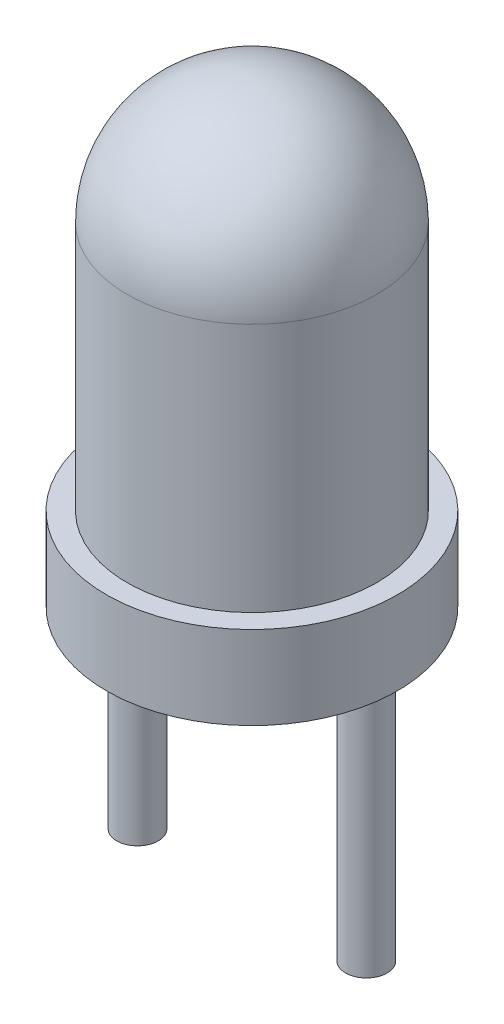
ISO-10303-21;
HEADER;
FILE_DESCRIPTION(('STEP AP214'),'2;1');
FILE_NAME('part.step','',(''),(''),'','','');
FILE_SCHEMA(('AUTOMOTIVE_DESIGN { 1 0 10303 214 1 1 1 1 }'));
ENDSEC;
DATA;
#1=APPLICATION_CONTEXT('core data for automotive mechanical design processes');
#2=APPLICATION_PROTOCOL_DEFINITION('international standard','automotive_design',2000,#1);
#3=PRODUCT_CONTEXT('',#1,'mechanical');
#4=PRODUCT('Part','Part','',(#3));
#5=PRODUCT_RELATED_PRODUCT_CATEGORY('part','',(#4));
#6=PRODUCT_DEFINITION_FORMATION('','',#4);
#7=PRODUCT_DEFINITION_CONTEXT('part definition',#1,'design');
#8=PRODUCT_DEFINITION('design','',#6,#7);
#9=PRODUCT_DEFINITION_SHAPE('','',#8);
#10=(LENGTH_UNIT() NAMED_UNIT(*) SI_UNIT(.MILLI.,.METRE.));
#11=(NAMED_UNIT(*) PLANE_ANGLE_UNIT() SI_UNIT($,.RADIAN.));
#12=(NAMED_UNIT(*) SI_UNIT($,.STERADIAN.) SOLID_ANGLE_UNIT());
#13=UNCERTAINTY_MEASURE_WITH_UNIT(LENGTH_MEASURE(1.E-05),#10,'distance_accuracy_value','');
#14=(GEOMETRIC_REPRESENTATION_CONTEXT(3) GLOBAL_UNCERTAINTY_ASSIGNED_CONTEXT((#13)) GLOBAL_UNIT_ASSIGNED_CONTEXT((#10,
#11,#12)) REPRESENTATION_CONTEXT('',''));
#15=CARTESIAN_POINT('',(0.,0.,0.));
#16=DIRECTION('',(0.,0.,1.));
#17=DIRECTION('',(1.,0.,0.));
#18=AXIS2_PLACEMENT_3D('',#15,#16,#17);
#19=CARTESIAN_POINT('',(0.,0.,0.));
#20=DIRECTION('',(0.,-1.,0.));
#21=DIRECTION('',(1.,0.,0.));
#22=AXIS2_PLACEMENT_3D('',#19,#20,#21);
#23=PLANE('',#22);
#24=CARTESIAN_POINT('',(-1.375,0.,0.));
#25=DIRECTION('',(0.,-1.,0.));
#26=DIRECTION('',(1.,0.,0.));
#27=AXIS2_PLACEMENT_3D('',#24,#25,#26);
#28=CIRCLE('',#27,0.25);
#29=CARTESIAN_POINT('',(-1.125,0.,0.));
#30=VERTEX_POINT('',#29);
#31=EDGE_CURVE('E53',#30,#30,#28,.T.);
#32=ORIENTED_EDGE('',*,*,#31,.F.);
#33=EDGE_LOOP('',(#32));
#34=FACE_BOUND('',#33,.T.);
#35=CARTESIAN_POINT('',(0.,0.,0.));
#36=DIRECTION('',(0.,1.,0.));
#37=DIRECTION('',(-1.,0.,0.));
#38=AXIS2_PLACEMENT_3D('',#35,#36,#37);
#39=CIRCLE('',#38,1.75);
#40=CARTESIAN_POINT('',(-1.75,0.,0.));
#41=VERTEX_POINT('',#40);
#42=EDGE_CURVE('E10',#41,#41,#39,.T.);
#43=ORIENTED_EDGE('',*,*,#42,.F.);
#44=EDGE_LOOP('',(#43));
#45=FACE_BOUND('',#44,.T.);
#46=CARTESIAN_POINT('',(1.375,0.,0.));
#47=DIRECTION('',(0.,-1.,0.));
#48=DIRECTION('',(1.,0.,0.));
#49=AXIS2_PLACEMENT_3D('',#46,#47,#48);
#50=CIRCLE('',#49,0.25);
#51=CARTESIAN_POINT('',(1.625,0.,0.));
#52=VERTEX_POINT('',#51);
#53=EDGE_CURVE('E59',#52,#52,#50,.T.);
#54=ORIENTED_EDGE('',*,*,#53,.F.);
#55=EDGE_LOOP('',(#54));
#56=FACE_BOUND('',#55,.T.);
#57=ADVANCED_FACE('F33',(#34,#45,#56),#23,.T.);
#58=CARTESIAN_POINT('',(0.,5.5,0.));
#59=DIRECTION('',(0.,1.,0.));
#60=DIRECTION('',(-1.,0.,0.));
#61=AXIS2_PLACEMENT_3D('',#58,#59,#60);
#62=CYLINDRICAL_SURFACE('',#61,1.75);
#63=ORIENTED_EDGE('',*,*,#42,.T.);
#64=EDGE_LOOP('',(#63));
#65=FACE_BOUND('',#64,.T.);
#66=CARTESIAN_POINT('',(0.,1.,0.));
#67=DIRECTION('',(0.,1.,0.));
#68=DIRECTION('',(-1.,0.,0.));
#69=AXIS2_PLACEMENT_3D('',#66,#67,#68);
#70=CIRCLE('',#69,1.75);
#71=CARTESIAN_POINT('',(-1.75,1.,0.));
#72=VERTEX_POINT('',#71);
#73=EDGE_CURVE('E39',#72,#72,#70,.T.);
#74=ORIENTED_EDGE('',*,*,#73,.F.);
#75=EDGE_LOOP('',(#74));
#76=FACE_BOUND('',#75,.T.);
#77=ADVANCED_FACE('F75',(#65,#76),#62,.T.);
#78=CARTESIAN_POINT('',(-1.75,1.,0.));
#79=DIRECTION('',(0.,1.,0.));
#80=DIRECTION('',(-1.,0.,0.));
#81=AXIS2_PLACEMENT_3D('',#78,#79,#80);
#82=PLANE('',#81);
#83=ORIENTED_EDGE('',*,*,#73,.T.);
#84=EDGE_LOOP('',(#83));
#85=FACE_BOUND('',#84,.T.);
#86=CARTESIAN_POINT('',(0.,1.,0.));
#87=DIRECTION('',(0.,1.,0.));
#88=DIRECTION('',(-1.,0.,0.));
#89=AXIS2_PLACEMENT_3D('',#86,#87,#88);
#90=CIRCLE('',#89,1.5);
#91=CARTESIAN_POINT('',(-1.5,1.,0.));
#92=VERTEX_POINT('',#91);
#93=EDGE_CURVE('E43',#92,#92,#90,.T.);
#94=ORIENTED_EDGE('',*,*,#93,.F.);
#95=EDGE_LOOP('',(#94));
#96=FACE_BOUND('',#95,.T.);
#97=ADVANCED_FACE('F80',(#85,#96),#82,.T.);
#98=CARTESIAN_POINT('',(0.,5.5,0.));
#99=DIRECTION('',(0.,1.,0.));
#100=DIRECTION('',(-1.,0.,0.));
#101=AXIS2_PLACEMENT_3D('',#98,#99,#100);
#102=CYLINDRICAL_SURFACE('',#101,1.5);
#103=ORIENTED_EDGE('',*,*,#93,.T.);
#104=EDGE_LOOP('',(#103));
#105=FACE_BOUND('',#104,.T.);
#106=CARTESIAN_POINT('',(0.,4.,0.));
#107=DIRECTION('',(0.,1.,0.));
#108=DIRECTION('',(-1.,0.,0.));
#109=AXIS2_PLACEMENT_3D('',#106,#107,#108);
#110=CIRCLE('',#109,1.5);
#111=CARTESIAN_POINT('',(-1.5,4.,0.));
#112=VERTEX_POINT('',#111);
#113=EDGE_CURVE('E47',#112,#112,#110,.T.);
#114=ORIENTED_EDGE('',*,*,#113,.F.);
#115=EDGE_LOOP('',(#114));
#116=FACE_BOUND('',#115,.T.);
#117=ADVANCED_FACE('F95',(#105,#116),#102,.T.);
#118=CARTESIAN_POINT('',(0.,4.,0.));
#119=DIRECTION('',(0.,1.,0.));
#120=DIRECTION('',(-1.,0.,0.));
#121=AXIS2_PLACEMENT_3D('',#118,#119,#120);
#122=SPHERICAL_SURFACE('',#121,1.5);
#123=ORIENTED_EDGE('',*,*,#113,.T.);
#124=EDGE_LOOP('',(#123));
#125=FACE_BOUND('',#124,.T.);
#126=ADVANCED_FACE('F86',(#125),#122,.T.);
#127=CARTESIAN_POINT('',(-1.375,-3.,0.));
#128=DIRECTION('',(0.,1.,0.));
#129=DIRECTION('',(-1.,0.,0.));
#130=AXIS2_PLACEMENT_3D('',#127,#128,#129);
#131=CYLINDRICAL_SURFACE('',#130,0.25);
#132=CARTESIAN_POINT('',(-1.375,-3.,0.));
#133=DIRECTION('',(0.,-1.,0.));
#134=DIRECTION('',(1.,0.,0.));
#135=AXIS2_PLACEMENT_3D('',#132,#133,#134);
#136=CIRCLE('',#135,0.25);
#137=CARTESIAN_POINT('',(-1.125,-3.,0.));
#138=VERTEX_POINT('',#137);
#139=EDGE_CURVE('E52',#138,#138,#136,.T.);
#140=ORIENTED_EDGE('',*,*,#139,.F.);
#141=EDGE_LOOP('',(#140));
#142=FACE_BOUND('',#141,.T.);
#143=ORIENTED_EDGE('',*,*,#31,.T.);
#144=EDGE_LOOP('',(#143));
#145=FACE_BOUND('',#144,.T.);
#146=ADVANCED_FACE('F84',(#142,#145),#131,.T.);
#147=CARTESIAN_POINT('',(-1.375,-3.,0.));
#148=DIRECTION('',(0.,-1.,0.));
#149=DIRECTION('',(1.,0.,0.));
#150=AXIS2_PLACEMENT_3D('',#147,#148,#149);
#151=PLANE('',#150);
#152=ORIENTED_EDGE('',*,*,#139,.T.);
#153=EDGE_LOOP('',(#152));
#154=FACE_BOUND('',#153,.T.);
#155=ADVANCED_FACE('F70',(#154),#151,.T.);
#156=CARTESIAN_POINT('',(1.375,-3.,0.));
#157=DIRECTION('',(0.,1.,0.));
#158=DIRECTION('',(-1.,0.,0.));
#159=AXIS2_PLACEMENT_3D('',#156,#157,#158);
#160=CYLINDRICAL_SURFACE('',#159,0.25);
#161=CARTESIAN_POINT('',(1.375,-3.,0.));
#162=DIRECTION('',(0.,-1.,0.));
#163=DIRECTION('',(1.,0.,0.));
#164=AXIS2_PLACEMENT_3D('',#161,#162,#163);
#165=CIRCLE('',#164,0.25);
#166=CARTESIAN_POINT('',(1.625,-3.,0.));
#167=VERTEX_POINT('',#166);
#168=EDGE_CURVE('E56',#167,#167,#165,.T.);
#169=ORIENTED_EDGE('',*,*,#168,.F.);
#170=EDGE_LOOP('',(#169));
#171=FACE_BOUND('',#170,.T.);
#172=ORIENTED_EDGE('',*,*,#53,.T.);
#173=EDGE_LOOP('',(#172));
#174=FACE_BOUND('',#173,.T.);
#175=ADVANCED_FACE('F67',(#171,#174),#160,.T.);
#176=CARTESIAN_POINT('',(1.375,-3.,0.));
#177=DIRECTION('',(0.,-1.,0.));
#178=DIRECTION('',(1.,0.,0.));
#179=AXIS2_PLACEMENT_3D('',#176,#177,#178);
#180=PLANE('',#179);
#181=ORIENTED_EDGE('',*,*,#168,.T.);
#182=EDGE_LOOP('',(#181));
#183=FACE_BOUND('',#182,.T.);
#184=ADVANCED_FACE('F65',(#183),#180,.T.);
#185=CLOSED_SHELL('',(#57,#77,#97,#117,#126,#146,#155,#175,#184));
#186=MANIFOLD_SOLID_BREP('B2',#185);
#187=ADVANCED_BREP_SHAPE_REPRESENTATION('',(#18,#186),#14);
#188=SHAPE_DEFINITION_REPRESENTATION(#9,#187);
ENDSEC;
END-ISO-10303-21;
